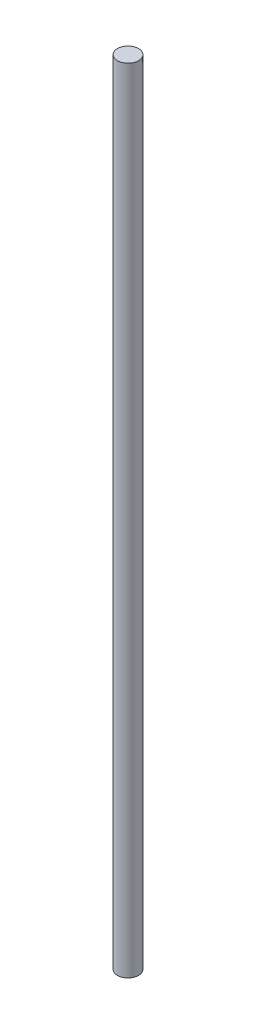
ISO-10303-21;
HEADER;
FILE_DESCRIPTION(('STEP AP214'),'2;1');
FILE_NAME('part.step','',(''),(''),'','','');
FILE_SCHEMA(('AUTOMOTIVE_DESIGN { 1 0 10303 214 1 1 1 1 }'));
ENDSEC;
DATA;
#1=APPLICATION_CONTEXT('core data for automotive mechanical design processes');
#2=APPLICATION_PROTOCOL_DEFINITION('international standard','automotive_design',2000,#1);
#3=PRODUCT_CONTEXT('',#1,'mechanical');
#4=PRODUCT('Part','Part','',(#3));
#5=PRODUCT_RELATED_PRODUCT_CATEGORY('part','',(#4));
#6=PRODUCT_DEFINITION_FORMATION('','',#4);
#7=PRODUCT_DEFINITION_CONTEXT('part definition',#1,'design');
#8=PRODUCT_DEFINITION('design','',#6,#7);
#9=PRODUCT_DEFINITION_SHAPE('','',#8);
#10=(LENGTH_UNIT() NAMED_UNIT(*) SI_UNIT(.MILLI.,.METRE.));
#11=(NAMED_UNIT(*) PLANE_ANGLE_UNIT() SI_UNIT($,.RADIAN.));
#12=(NAMED_UNIT(*) SI_UNIT($,.STERADIAN.) SOLID_ANGLE_UNIT());
#13=UNCERTAINTY_MEASURE_WITH_UNIT(LENGTH_MEASURE(1.E-05),#10,'distance_accuracy_value','');
#14=(GEOMETRIC_REPRESENTATION_CONTEXT(3) GLOBAL_UNCERTAINTY_ASSIGNED_CONTEXT((#13)) GLOBAL_UNIT_ASSIGNED_CONTEXT((#10,
#11,#12)) REPRESENTATION_CONTEXT('',''));
#15=CARTESIAN_POINT('',(0.,0.,0.));
#16=DIRECTION('',(0.,0.,1.));
#17=DIRECTION('',(1.,0.,0.));
#18=AXIS2_PLACEMENT_3D('',#15,#16,#17);
#19=CARTESIAN_POINT('',(-4.91107756620969,149.225,-2.45553878310485));
#20=DIRECTION('',(0.,-1.,0.));
#21=DIRECTION('',(0.,0.,-1.));
#22=AXIS2_PLACEMENT_3D('',#19,#20,#21);
#23=CYLINDRICAL_SURFACE('',#22,1.984375);
#24=CARTESIAN_POINT('',(-4.91107756620969,149.225,-2.45553878310485));
#25=DIRECTION('',(0.,1.,0.));
#26=DIRECTION('',(0.,0.,1.));
#27=AXIS2_PLACEMENT_3D('',#24,#25,#26);
#28=CIRCLE('',#27,1.984375);
#29=CARTESIAN_POINT('',(-4.91107756620969,149.225,-0.471163783104846));
#30=VERTEX_POINT('',#29);
#31=EDGE_CURVE('E10',#30,#30,#28,.T.);
#32=ORIENTED_EDGE('',*,*,#31,.F.);
#33=EDGE_LOOP('',(#32));
#34=FACE_BOUND('',#33,.T.);
#35=CARTESIAN_POINT('',(-4.91107756620969,0.,-2.45553878310485));
#36=DIRECTION('',(0.,1.,0.));
#37=DIRECTION('',(0.,0.,1.));
#38=AXIS2_PLACEMENT_3D('',#35,#36,#37);
#39=CIRCLE('',#38,1.984375);
#40=CARTESIAN_POINT('',(-4.91107756620969,0.,-0.471163783104846));
#41=VERTEX_POINT('',#40);
#42=EDGE_CURVE('E34',#41,#41,#39,.T.);
#43=ORIENTED_EDGE('',*,*,#42,.T.);
#44=EDGE_LOOP('',(#43));
#45=FACE_BOUND('',#44,.T.);
#46=ADVANCED_FACE('F31',(#34,#45),#23,.T.);
#47=CARTESIAN_POINT('',(-4.91107756620969,149.225,-2.45553878310485));
#48=DIRECTION('',(0.,1.,0.));
#49=DIRECTION('',(0.,0.,1.));
#50=AXIS2_PLACEMENT_3D('',#47,#48,#49);
#51=PLANE('',#50);
#52=ORIENTED_EDGE('',*,*,#31,.T.);
#53=EDGE_LOOP('',(#52));
#54=FACE_BOUND('',#53,.T.);
#55=ADVANCED_FACE('F46',(#54),#51,.T.);
#56=CARTESIAN_POINT('',(-4.91107756620969,0.,-2.45553878310485));
#57=DIRECTION('',(0.,1.,0.));
#58=DIRECTION('',(0.,0.,1.));
#59=AXIS2_PLACEMENT_3D('',#56,#57,#58);
#60=PLANE('',#59);
#61=ORIENTED_EDGE('',*,*,#42,.F.);
#62=EDGE_LOOP('',(#61));
#63=FACE_BOUND('',#62,.T.);
#64=ADVANCED_FACE('F44',(#63),#60,.F.);
#65=CLOSED_SHELL('',(#46,#55,#64));
#66=MANIFOLD_SOLID_BREP('B2',#65);
#67=ADVANCED_BREP_SHAPE_REPRESENTATION('',(#18,#66),#14);
#68=SHAPE_DEFINITION_REPRESENTATION(#9,#67);
ENDSEC;
END-ISO-10303-21;
